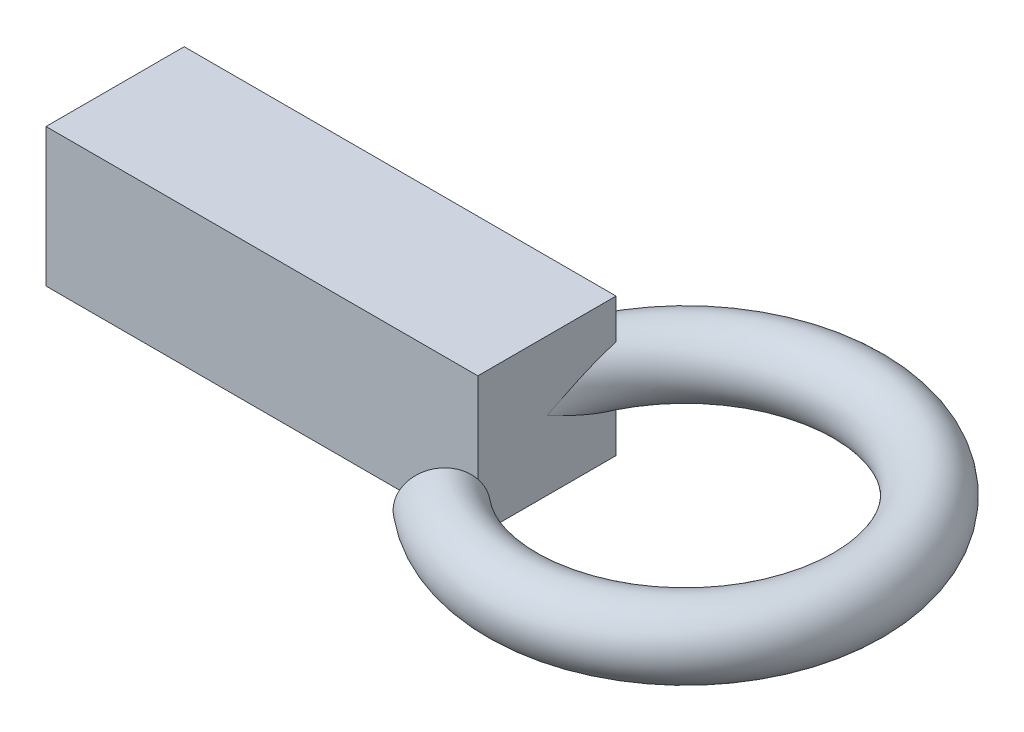
ISO-10303-21;
HEADER;
FILE_DESCRIPTION(('STEP AP214'),'2;1');
FILE_NAME('part.step','',(''),(''),'','','');
FILE_SCHEMA(('AUTOMOTIVE_DESIGN { 1 0 10303 214 1 1 1 1 }'));
ENDSEC;
DATA;
#1=APPLICATION_CONTEXT('core data for automotive mechanical design processes');
#2=APPLICATION_PROTOCOL_DEFINITION('international standard','automotive_design',2000,#1);
#3=PRODUCT_CONTEXT('',#1,'mechanical');
#4=PRODUCT('Part','Part','',(#3));
#5=PRODUCT_RELATED_PRODUCT_CATEGORY('part','',(#4));
#6=PRODUCT_DEFINITION_FORMATION('','',#4);
#7=PRODUCT_DEFINITION_CONTEXT('part definition',#1,'design');
#8=PRODUCT_DEFINITION('design','',#6,#7);
#9=PRODUCT_DEFINITION_SHAPE('','',#8);
#10=(LENGTH_UNIT() NAMED_UNIT(*) SI_UNIT(.MILLI.,.METRE.));
#11=(NAMED_UNIT(*) PLANE_ANGLE_UNIT() SI_UNIT($,.RADIAN.));
#12=(NAMED_UNIT(*) SI_UNIT($,.STERADIAN.) SOLID_ANGLE_UNIT());
#13=UNCERTAINTY_MEASURE_WITH_UNIT(LENGTH_MEASURE(1.E-05),#10,'distance_accuracy_value','');
#14=(GEOMETRIC_REPRESENTATION_CONTEXT(3) GLOBAL_UNCERTAINTY_ASSIGNED_CONTEXT((#13)) GLOBAL_UNIT_ASSIGNED_CONTEXT((#10,
#11,#12)) REPRESENTATION_CONTEXT('',''));
#15=CARTESIAN_POINT('',(0.,0.,0.));
#16=DIRECTION('',(0.,0.,1.));
#17=DIRECTION('',(1.,0.,0.));
#18=AXIS2_PLACEMENT_3D('',#15,#16,#17);
#19=CARTESIAN_POINT('',(-46.,8.,8.));
#20=DIRECTION('',(1.,0.,0.));
#21=DIRECTION('',(0.,0.,-1.));
#22=AXIS2_PLACEMENT_3D('',#19,#20,#21);
#23=PLANE('',#22);
#24=CARTESIAN_POINT('',(-46.,0.,0.));
#25=DIRECTION('',(-1.,0.,0.));
#26=DIRECTION('',(0.,0.,1.));
#27=AXIS2_PLACEMENT_3D('',#24,#25,#26);
#28=CIRCLE('',#27,3.4);
#29=CARTESIAN_POINT('',(-46.,0.,3.4));
#30=VERTEX_POINT('',#29);
#31=EDGE_CURVE('E106',#30,#30,#28,.T.);
#32=ORIENTED_EDGE('',*,*,#31,.F.);
#33=EDGE_LOOP('',(#32));
#34=FACE_BOUND('',#33,.T.);
#35=DIRECTION('',(0.,0.,1.));
#36=VECTOR('',#35,1.);
#37=CARTESIAN_POINT('',(-46.,-8.,8.));
#38=LINE('',#37,#36);
#39=CARTESIAN_POINT('',(-46.,-8.,-8.));
#40=VERTEX_POINT('',#39);
#41=CARTESIAN_POINT('',(-46.,-8.,8.));
#42=VERTEX_POINT('',#41);
#43=EDGE_CURVE('E105',#40,#42,#38,.T.);
#44=ORIENTED_EDGE('',*,*,#43,.T.);
#45=DIRECTION('',(0.,-1.,0.));
#46=VECTOR('',#45,1.);
#47=CARTESIAN_POINT('',(-46.,8.,8.));
#48=LINE('',#47,#46);
#49=CARTESIAN_POINT('',(-46.,8.,8.));
#50=VERTEX_POINT('',#49);
#51=EDGE_CURVE('E137',#50,#42,#48,.T.);
#52=ORIENTED_EDGE('',*,*,#51,.F.);
#53=DIRECTION('',(0.,0.,1.));
#54=VECTOR('',#53,1.);
#55=CARTESIAN_POINT('',(-46.,8.,8.));
#56=LINE('',#55,#54);
#57=CARTESIAN_POINT('',(-46.,8.,-8.));
#58=VERTEX_POINT('',#57);
#59=EDGE_CURVE('E114',#58,#50,#56,.T.);
#60=ORIENTED_EDGE('',*,*,#59,.F.);
#61=DIRECTION('',(0.,-1.,0.));
#62=VECTOR('',#61,1.);
#63=CARTESIAN_POINT('',(-46.,8.,-8.));
#64=LINE('',#63,#62);
#65=EDGE_CURVE('E123',#58,#40,#64,.T.);
#66=ORIENTED_EDGE('',*,*,#65,.T.);
#67=EDGE_LOOP('',(#44,#52,#60,#66));
#68=FACE_BOUND('',#67,.T.);
#69=ADVANCED_FACE('F40',(#34,#68),#23,.F.);
#70=CARTESIAN_POINT('',(4.,8.,8.));
#71=DIRECTION('',(0.,0.,-1.));
#72=DIRECTION('',(-1.,0.,0.));
#73=AXIS2_PLACEMENT_3D('',#70,#71,#72);
#74=PLANE('',#73);
#75=DIRECTION('',(1.,0.,0.));
#76=VECTOR('',#75,1.);
#77=CARTESIAN_POINT('',(4.,-8.,8.));
#78=LINE('',#77,#76);
#79=CARTESIAN_POINT('',(4.,-8.,8.));
#80=VERTEX_POINT('',#79);
#81=EDGE_CURVE('E109',#42,#80,#78,.T.);
#82=ORIENTED_EDGE('',*,*,#81,.T.);
#83=DIRECTION('',(0.,-1.,0.));
#84=VECTOR('',#83,1.);
#85=CARTESIAN_POINT('',(4.,8.,8.));
#86=LINE('',#85,#84);
#87=CARTESIAN_POINT('',(4.,8.,8.));
#88=VERTEX_POINT('',#87);
#89=EDGE_CURVE('E134',#88,#80,#86,.T.);
#90=ORIENTED_EDGE('',*,*,#89,.F.);
#91=DIRECTION('',(1.,0.,0.));
#92=VECTOR('',#91,1.);
#93=CARTESIAN_POINT('',(4.,8.,8.));
#94=LINE('',#93,#92);
#95=EDGE_CURVE('E117',#50,#88,#94,.T.);
#96=ORIENTED_EDGE('',*,*,#95,.F.);
#97=ORIENTED_EDGE('',*,*,#51,.T.);
#98=EDGE_LOOP('',(#82,#90,#96,#97));
#99=FACE_BOUND('',#98,.T.);
#100=ADVANCED_FACE('F167',(#99),#74,.F.);
#101=CARTESIAN_POINT('',(4.,8.,8.));
#102=DIRECTION('',(-1.,0.,0.));
#103=DIRECTION('',(0.,0.,1.));
#104=AXIS2_PLACEMENT_3D('',#101,#102,#103);
#105=PLANE('',#104);
#106=CARTESIAN_POINT('',(4.,0.,0.));
#107=CARTESIAN_POINT('',(4.,-0.00377123438427667,-0.00754247117398003));
#108=CARTESIAN_POINT('',(4.,-0.00754247058504559,-0.0150849435227683));
#109=CARTESIAN_POINT('',(4.00000000000005,-0.310476094820006,-0.620954275123391));
#110=CARTESIAN_POINT('',(4.00000000000001,-0.609578074142393,-1.21932381549683));
#111=CARTESIAN_POINT('',(3.99999999999999,-1.19622811549225,-2.42167869156613));
#112=CARTESIAN_POINT('',(4.,-1.48377750561781,-3.02566337185225));
#113=CARTESIAN_POINT('',(4.,-2.03478647915034,-4.24378350719688));
#114=CARTESIAN_POINT('',(4.,-2.29827917478982,-4.85790359273509));
#115=CARTESIAN_POINT('',(4.,-2.66503026414286,-5.79014690740583));
#116=CARTESIAN_POINT('',(4.,-2.78250744166196,-6.10266093858747));
#117=CARTESIAN_POINT('',(4.,-3.00592255187489,-6.73176660254089));
#118=CARTESIAN_POINT('',(4.,-3.11186222479747,-7.04835761229462));
#119=CARTESIAN_POINT('',(4.,-3.30251955374235,-7.66197536977994));
#120=CARTESIAN_POINT('',(4.,-3.38823247278577,-7.95869110738419));
#121=CARTESIAN_POINT('',(4.,-3.54581053916475,-8.55583579984154));
#122=CARTESIAN_POINT('',(4.,-3.61767464912955,-8.85626503106846));
#123=CARTESIAN_POINT('',(4.,-3.7453680928628,-9.4612138022541));
#124=CARTESIAN_POINT('',(4.,-3.80116325404704,-9.76574063855015));
#125=CARTESIAN_POINT('',(4.,-3.89385026027332,-10.3776780263353));
#126=CARTESIAN_POINT('',(4.,-3.93074497404804,-10.6850881329812));
#127=CARTESIAN_POINT('',(4.,-3.97888981327671,-11.2579288120443));
#128=CARTESIAN_POINT('',(4.,-3.99304100139695,-11.5231114505689));
#129=CARTESIAN_POINT('',(4.,-4.00297820361671,-12.0539166762168));
#130=CARTESIAN_POINT('',(4.,-3.99876187151914,-12.3195393152121));
#131=CARTESIAN_POINT('',(4.,-3.96955046211187,-12.8481564017722));
#132=CARTESIAN_POINT('',(4.,-3.94467541900814,-13.1111571706437));
#133=CARTESIAN_POINT('',(4.,-3.87154696614128,-13.6339037500635));
#134=CARTESIAN_POINT('',(4.,-3.82330551915244,-13.8936511564878));
#135=CARTESIAN_POINT('',(4.,-3.72600997105123,-14.3000350495018));
#136=CARTESIAN_POINT('',(4.,-3.68564244520513,-14.4487747327245));
#137=CARTESIAN_POINT('',(4.,-3.59528759397715,-14.7432442649358));
#138=CARTESIAN_POINT('',(4.,-3.54530538348311,-14.8889756688476));
#139=CARTESIAN_POINT('',(4.,-3.43460113581124,-15.1777385092482));
#140=CARTESIAN_POINT('',(4.,-3.37379265612387,-15.3207371106529));
#141=CARTESIAN_POINT('',(4.,-3.24099762070377,-15.6016835250285));
#142=CARTESIAN_POINT('',(4.,-3.16899498499202,-15.7396237138912));
#143=CARTESIAN_POINT('',(4.,-3.09111855280429,-15.8742840697425));
#144=B_SPLINE_CURVE_WITH_KNOTS('',3,(#106,#107,#108,#109,#110,#111,#112,#113,#114,#115,#116,
#117,#118,#119,#120,#121,#122,#123,#124,#125,#126,#127,#128,#129,#130,#131,#132,#133,#134,#135,
#136,#137,#138,#139,#140,#141,#142,#143),.UNSPECIFIED.,.F.,.F.,(4,2,2,2,2,2,2,2,2,2,2,2,2,2,2,2,
2,2,4),(0.,0.0252982212813502,2.03214568439839,4.03876177412949,6.04257290148961,
7.04398987419776,8.04525559103838,8.97151591888568,9.89784560303596,10.8261309348252,
11.7542753285717,12.5504103705687,13.3466471108064,14.1382895470012,14.9295271179056,
15.3916090999346,15.8534459367827,16.3191507618209,16.7855308427105),.UNSPECIFIED.);
#145=CARTESIAN_POINT('',(4.,0.,0.));
#146=VERTEX_POINT('',#145);
#147=CARTESIAN_POINT('',(4.,-3.39731552846254,-8.));
#148=VERTEX_POINT('',#147);
#149=EDGE_CURVE('E11',#146,#148,#144,.T.);
#150=ORIENTED_EDGE('',*,*,#149,.F.);
#151=CARTESIAN_POINT('',(4.,0.,0.));
#152=CARTESIAN_POINT('',(4.,0.00377123438427667,-0.00754247117398003));
#153=CARTESIAN_POINT('',(4.,0.00754247058504559,-0.0150849435227683));
#154=CARTESIAN_POINT('',(4.00000000000005,0.310476094820006,-0.620954275123391));
#155=CARTESIAN_POINT('',(4.00000000000001,0.609578074142393,-1.21932381549683));
#156=CARTESIAN_POINT('',(3.99999999999999,1.19622811549225,-2.42167869156613));
#157=CARTESIAN_POINT('',(4.,1.48377750561781,-3.02566337185225));
#158=CARTESIAN_POINT('',(4.,2.03478647915034,-4.24378350719688));
#159=CARTESIAN_POINT('',(4.,2.29827917478982,-4.85790359273509));
#160=CARTESIAN_POINT('',(4.,2.66503026414286,-5.79014690740583));
#161=CARTESIAN_POINT('',(4.,2.78250744166196,-6.10266093858747));
#162=CARTESIAN_POINT('',(4.,3.00592255187489,-6.73176660254089));
#163=CARTESIAN_POINT('',(4.,3.11186222479747,-7.04835761229462));
#164=CARTESIAN_POINT('',(4.,3.30251955374235,-7.66197536977994));
#165=CARTESIAN_POINT('',(4.,3.38823247278577,-7.95869110738419));
#166=CARTESIAN_POINT('',(4.,3.54581053916475,-8.55583579984154));
#167=CARTESIAN_POINT('',(4.,3.61767464912955,-8.85626503106846));
#168=CARTESIAN_POINT('',(4.,3.7453680928628,-9.4612138022541));
#169=CARTESIAN_POINT('',(4.,3.80116325404704,-9.76574063855015));
#170=CARTESIAN_POINT('',(4.,3.89385026027332,-10.3776780263353));
#171=CARTESIAN_POINT('',(4.,3.93074497404804,-10.6850881329812));
#172=CARTESIAN_POINT('',(4.,3.97888981327671,-11.2579288120443));
#173=CARTESIAN_POINT('',(4.,3.99304100139695,-11.5231114505689));
#174=CARTESIAN_POINT('',(4.,4.00297820361671,-12.0539166762168));
#175=CARTESIAN_POINT('',(4.,3.99876187151914,-12.3195393152121));
#176=CARTESIAN_POINT('',(4.,3.96955046211187,-12.8481564017722));
#177=CARTESIAN_POINT('',(4.,3.94467541900814,-13.1111571706437));
#178=CARTESIAN_POINT('',(4.,3.87154696614128,-13.6339037500635));
#179=CARTESIAN_POINT('',(4.,3.82330551915244,-13.8936511564878));
#180=CARTESIAN_POINT('',(4.,3.72600997105123,-14.3000350495018));
#181=CARTESIAN_POINT('',(4.,3.68564244520513,-14.4487747327245));
#182=CARTESIAN_POINT('',(4.,3.59528759397715,-14.7432442649358));
#183=CARTESIAN_POINT('',(4.,3.54530538348311,-14.8889756688476));
#184=CARTESIAN_POINT('',(4.,3.43460113581124,-15.1777385092482));
#185=CARTESIAN_POINT('',(4.,3.37379265612387,-15.3207371106529));
#186=CARTESIAN_POINT('',(4.,3.24099762070377,-15.6016835250285));
#187=CARTESIAN_POINT('',(4.,3.16899498499202,-15.7396237138912));
#188=CARTESIAN_POINT('',(4.,3.09111855280429,-15.8742840697425));
#189=B_SPLINE_CURVE_WITH_KNOTS('',3,(#151,#152,#153,#154,#155,#156,#157,#158,#159,#160,#161,
#162,#163,#164,#165,#166,#167,#168,#169,#170,#171,#172,#173,#174,#175,#176,#177,#178,#179,#180,
#181,#182,#183,#184,#185,#186,#187,#188),.UNSPECIFIED.,.F.,.F.,(4,2,2,2,2,2,2,2,2,2,2,2,2,2,2,2,
2,2,4),(0.,0.0252982212813502,2.03214568439839,4.03876177412949,6.04257290148961,
7.04398987419776,8.04525559103838,8.97151591888568,9.89784560303596,10.8261309348252,
11.7542753285717,12.5504103705687,13.3466471108064,14.1382895470012,14.9295271179056,
15.3916090999346,15.8534459367827,16.3191507618209,16.7855308427105),.UNSPECIFIED.);
#190=CARTESIAN_POINT('',(4.00000000000118,3.39731552846188,-8.));
#191=VERTEX_POINT('',#190);
#192=EDGE_CURVE('E53',#191,#146,#189,.F.);
#193=ORIENTED_EDGE('',*,*,#192,.F.);
#194=DIRECTION('',(0.,-1.,0.));
#195=VECTOR('',#194,1.);
#196=CARTESIAN_POINT('',(4.,8.,-8.));
#197=LINE('',#196,#195);
#198=CARTESIAN_POINT('',(4.,8.,-8.));
#199=VERTEX_POINT('',#198);
#200=EDGE_CURVE('E60',#199,#191,#197,.T.);
#201=ORIENTED_EDGE('',*,*,#200,.F.);
#202=DIRECTION('',(0.,0.,-1.));
#203=VECTOR('',#202,1.);
#204=CARTESIAN_POINT('',(4.,8.,8.));
#205=LINE('',#204,#203);
#206=EDGE_CURVE('E120',#88,#199,#205,.T.);
#207=ORIENTED_EDGE('',*,*,#206,.F.);
#208=ORIENTED_EDGE('',*,*,#89,.T.);
#209=DIRECTION('',(0.,0.,-1.));
#210=VECTOR('',#209,1.);
#211=CARTESIAN_POINT('',(4.,-8.,8.));
#212=LINE('',#211,#210);
#213=CARTESIAN_POINT('',(4.,-8.,-8.));
#214=VERTEX_POINT('',#213);
#215=EDGE_CURVE('E126',#80,#214,#212,.T.);
#216=ORIENTED_EDGE('',*,*,#215,.T.);
#217=EDGE_CURVE('E132',#148,#214,#197,.T.);
#218=ORIENTED_EDGE('',*,*,#217,.F.);
#219=EDGE_LOOP('',(#150,#193,#201,#207,#208,#216,#218));
#220=FACE_BOUND('',#219,.T.);
#221=ADVANCED_FACE('F161',(#220),#105,.F.);
#222=CARTESIAN_POINT('',(4.,8.,-8.));
#223=DIRECTION('',(0.,0.,1.));
#224=DIRECTION('',(1.,0.,0.));
#225=AXIS2_PLACEMENT_3D('',#222,#223,#224);
#226=PLANE('',#225);
#227=CARTESIAN_POINT('',(-1.91813324047437,-2.21237098211823,-8.));
#228=CARTESIAN_POINT('',(-2.04281968004621,-2.03592268123638,-8.));
#229=CARTESIAN_POINT('',(-2.15313345145666,-1.84915600177252,-8.));
#230=CARTESIAN_POINT('',(-2.34115725178285,-1.45972556908713,-8.));
#231=CARTESIAN_POINT('',(-2.41884400629237,-1.25705058962564,-8.));
#232=CARTESIAN_POINT('',(-2.53880882046758,-0.841251179909869,-8.));
#233=CARTESIAN_POINT('',(-2.58105689686851,-0.628118062466796,-8.));
#234=CARTESIAN_POINT('',(-2.62843378159131,-0.197797165469814,-8.));
#235=CARTESIAN_POINT('',(-2.63357003722268,0.0193897918204563,-8.));
#236=CARTESIAN_POINT('',(-2.60679128013833,0.447668366354804,-8.));
#237=CARTESIAN_POINT('',(-2.5755167134589,0.658800392588246,-8.));
#238=CARTESIAN_POINT('',(-2.47810294856619,1.0728414802993,-8.));
#239=CARTESIAN_POINT('',(-2.41196381464751,1.27575055694032,-8.));
#240=CARTESIAN_POINT('',(-2.24677889514995,1.66873076205972,-8.));
#241=CARTESIAN_POINT('',(-2.14758789517828,1.8587407030001,-8.));
#242=CARTESIAN_POINT('',(-1.91972032250424,2.22013597297991,-8.));
#243=CARTESIAN_POINT('',(-1.79104028761106,2.39151911163433,-8.));
#244=CARTESIAN_POINT('',(-1.50337393162601,2.7172692043475,-8.));
#245=CARTESIAN_POINT('',(-1.343499266483,2.87085056563841,-8.));
#246=CARTESIAN_POINT('',(-1.00146008749896,3.15072522179999,-8.));
#247=CARTESIAN_POINT('',(-0.819290562518248,3.27701236413401,-8.));
#248=CARTESIAN_POINT('',(-0.426820174936007,3.50652693757035,-8.));
#249=CARTESIAN_POINT('',(-0.215505722674584,3.60801955022575,-8.));
#250=CARTESIAN_POINT('',(0.220387742930391,3.77665309444852,-8.));
#251=CARTESIAN_POINT('',(0.444970702377723,3.84378374869252,-8.));
#252=CARTESIAN_POINT('',(0.917386763105667,3.94658065741515,-8.));
#253=CARTESIAN_POINT('',(1.16575819906745,3.97977390392674,-8.));
#254=CARTESIAN_POINT('',(1.66462757045102,4.00658236226624,-8.));
#255=CARTESIAN_POINT('',(1.9151261644815,4.00018483401566,-8.));
#256=CARTESIAN_POINT('',(2.42723016784171,3.94707810812314,-8.));
#257=CARTESIAN_POINT('',(2.68858613078005,3.89794419115391,-8.));
#258=CARTESIAN_POINT('',(3.19981107797521,3.75754091976531,-8.));
#259=CARTESIAN_POINT('',(3.4496765217868,3.66625867304156,-8.));
#260=CARTESIAN_POINT('',(3.93624589043756,3.44090990897901,-8.));
#261=CARTESIAN_POINT('',(4.17252462354354,3.30592290055846,-8.));
#262=CARTESIAN_POINT('',(4.61774460856435,2.99606984561744,-8.));
#263=CARTESIAN_POINT('',(4.82668693303807,2.8212053644502,-8.));
#264=CARTESIAN_POINT('',(5.1076899735121,2.53688743213978,-8.));
#265=CARTESIAN_POINT('',(5.19404830683801,2.44125510284688,-8.));
#266=CARTESIAN_POINT('',(5.35748117077875,2.24238570482727,-8.));
#267=CARTESIAN_POINT('',(5.43456076364347,2.13915283277007,-8.));
#268=CARTESIAN_POINT('',(5.57833736626069,1.92578662093331,-8.));
#269=CARTESIAN_POINT('',(5.64504107146971,1.81565779594227,-8.));
#270=CARTESIAN_POINT('',(5.76706505186402,1.58926014935577,-8.));
#271=CARTESIAN_POINT('',(5.82238725047104,1.47299236939549,-8.));
#272=CARTESIAN_POINT('',(5.91459467273483,1.24998234888362,-8.));
#273=CARTESIAN_POINT('',(5.95291145370518,1.14383056888798,-8.));
#274=CARTESIAN_POINT('',(6.01943305261974,0.928408737445381,-8.));
#275=CARTESIAN_POINT('',(6.04763942059266,0.819139166762817,-8.));
#276=CARTESIAN_POINT('',(6.09345338896193,0.598479126985245,-8.));
#277=CARTESIAN_POINT('',(6.11106865129757,0.487090251391562,-8.));
#278=CARTESIAN_POINT('',(6.13541728051916,0.263131160570105,-8.));
#279=CARTESIAN_POINT('',(6.14215161773798,0.150561051582902,-8.));
#280=CARTESIAN_POINT('',(6.14447987945759,-0.0619017252188389,-8.));
#281=CARTESIAN_POINT('',(6.14125136943802,-0.161783284306514,-8.));
#282=CARTESIAN_POINT('',(6.12619789469959,-0.360928187309228,-8.));
#283=CARTESIAN_POINT('',(6.11437027431273,-0.460191330684955,-8.));
#284=CARTESIAN_POINT('',(6.08228596516549,-0.657301937164534,-8.));
#285=CARTESIAN_POINT('',(6.0620330594184,-0.755150015264947,-8.));
#286=CARTESIAN_POINT('',(6.01338202772603,-0.948811936887422,-8.));
#287=CARTESIAN_POINT('',(5.98498079485459,-1.04462498946663,-8.));
#288=CARTESIAN_POINT('',(5.88883942329831,-1.32577771292127,-8.));
#289=CARTESIAN_POINT('',(5.80973756832937,-1.50735513223044,-8.));
#290=CARTESIAN_POINT('',(5.6245902057424,-1.85603030114782,-8.));
#291=CARTESIAN_POINT('',(5.51853736883197,-2.02312409534509,-8.));
#292=CARTESIAN_POINT('',(5.27304410118173,-2.3539616301661,-8.));
#293=CARTESIAN_POINT('',(5.13149852289399,-2.51614234650429,-8.));
#294=CARTESIAN_POINT('',(4.82592002831266,-2.81766690634238,-8.));
#295=CARTESIAN_POINT('',(4.66187646722744,-2.95699987062915,-8.));
#296=CARTESIAN_POINT('',(4.2944130039611,-3.22673807958741,-8.));
#297=CARTESIAN_POINT('',(4.08863179554282,-3.35392999736972,-8.));
#298=CARTESIAN_POINT('',(3.66006594167276,-3.57544753224182,-8.));
#299=CARTESIAN_POINT('',(3.43727348485129,-3.66975793853195,-8.));
#300=CARTESIAN_POINT('',(2.95855371416888,-3.83127205977884,-8.));
#301=CARTESIAN_POINT('',(2.70148111543473,-3.89509034093744,-8.));
#302=CARTESIAN_POINT('',(2.18018546510734,-3.97992644525405,-8.));
#303=CARTESIAN_POINT('',(1.9159609741489,-4.00093558691079,-8.));
#304=CARTESIAN_POINT('',(1.51648615745908,-3.99946991048486,-8.));
#305=CARTESIAN_POINT('',(1.38100352166168,-3.99317329641622,-8.));
#306=CARTESIAN_POINT('',(1.11110287072351,-3.96891041888265,-8.));
#307=CARTESIAN_POINT('',(0.976684453405941,-3.9509487999444,-8.));
#308=CARTESIAN_POINT('',(0.709858453881394,-3.90329923214092,-8.));
#309=CARTESIAN_POINT('',(0.577452192975051,-3.87360389678402,-8.));
#310=CARTESIAN_POINT('',(0.315868094881807,-3.8025355676135,-8.));
#311=CARTESIAN_POINT('',(0.186688759867366,-3.76116810550846,-8.));
#312=CARTESIAN_POINT('',(-0.0627264839606308,-3.66859637734439,-8.));
#313=CARTESIAN_POINT('',(-0.183116667086022,-3.61780784249604,-8.));
#314=CARTESIAN_POINT('',(-0.418838272228203,-3.50571881729788,-8.));
#315=CARTESIAN_POINT('',(-0.534172061065029,-3.44442331251774,-8.));
#316=CARTESIAN_POINT('',(-0.758649962332366,-3.31168313863194,-8.));
#317=CARTESIAN_POINT('',(-0.867802016172371,-3.24025192416375,-8.));
#318=CARTESIAN_POINT('',(-1.07898538955151,-3.08762555641023,-8.));
#319=CARTESIAN_POINT('',(-1.18101927981496,-3.00643395723828,-8.));
#320=CARTESIAN_POINT('',(-1.39888036890484,-2.81558852099575,-8.));
#321=CARTESIAN_POINT('',(-1.51270323896189,-2.70362669736207,-8.));
#322=CARTESIAN_POINT('',(-1.72633530797948,-2.4671049206481,-8.));
#323=CARTESIAN_POINT('',(-1.82614563256988,-2.34254598088049,-8.));
#324=CARTESIAN_POINT('',(-1.91813324047437,-2.21237098211823,-8.));
#325=B_SPLINE_CURVE_WITH_KNOTS('',3,(#227,#228,#229,#230,#231,#232,#233,#234,#235,#236,#237,
#238,#239,#240,#241,#242,#243,#244,#245,#246,#247,#248,#249,#250,#251,#252,#253,#254,#255,#256,
#257,#258,#259,#260,#261,#262,#263,#264,#265,#266,#267,#268,#269,#270,#271,#272,#273,#274,#275,
#276,#277,#278,#279,#280,#281,#282,#283,#284,#285,#286,#287,#288,#289,#290,#291,#292,#293,#294,
#295,#296,#297,#298,#299,#300,#301,#302,#303,#304,#305,#306,#307,#308,#309,#310,#311,#312,#313,
#314,#315,#316,#317,#318,#319,#320,#321,#322,#323,#324),.UNSPECIFIED.,.T.,.F.,(4,2,2,2,2,2,2,2,
2,2,2,2,2,2,2,2,2,2,2,2,2,2,2,2,2,2,2,2,2,2,2,2,2,2,2,2,2,2,2,2,2,2,2,2,2,2,2,2,4),(0.,
0.647638573953495,1.29573835787641,1.94438592192466,2.59290331684464,3.23018383781938,
3.86746318357366,4.50758018753658,5.1477723836392,5.80993000423732,6.47223673002918,
7.17247350669498,7.87291959508927,8.62139279432573,9.37010686035738,10.1642938651001,
10.9587239563516,11.77111206988,12.5834682993533,12.9695789227553,13.355477929814,
13.741126877743,14.1267105991595,14.4648051945932,14.8028479345099,15.1406458284917,
15.4784135968643,15.7778488683385,16.0773766538753,16.3767700942095,16.6762778441881,
17.2677084229401,17.8593000130825,18.5024846737232,19.1459747101793,19.8687219313151,
20.5918030489668,21.3829195454789,22.1741964609036,22.5806631305778,22.9869680610263,
23.3935291730151,23.7998979283738,24.1913844279707,24.5826856783856,24.9734722730543,
25.3641169966152,25.8419517329519,26.3197480627632),.UNSPECIFIED.);
#326=EDGE_CURVE('E143',#148,#191,#325,.T.);
#327=ORIENTED_EDGE('',*,*,#326,.F.);
#328=ORIENTED_EDGE('',*,*,#217,.T.);
#329=DIRECTION('',(-1.,0.,0.));
#330=VECTOR('',#329,1.);
#331=CARTESIAN_POINT('',(4.,-8.,-8.));
#332=LINE('',#331,#330);
#333=EDGE_CURVE('E118',#214,#40,#332,.T.);
#334=ORIENTED_EDGE('',*,*,#333,.T.);
#335=ORIENTED_EDGE('',*,*,#65,.F.);
#336=DIRECTION('',(-1.,0.,0.));
#337=VECTOR('',#336,1.);
#338=CARTESIAN_POINT('',(4.,8.,-8.));
#339=LINE('',#338,#337);
#340=EDGE_CURVE('E122',#199,#58,#339,.T.);
#341=ORIENTED_EDGE('',*,*,#340,.F.);
#342=ORIENTED_EDGE('',*,*,#200,.T.);
#343=EDGE_LOOP('',(#327,#328,#334,#335,#341,#342));
#344=FACE_BOUND('',#343,.T.);
#345=ADVANCED_FACE('F156',(#344),#226,.F.);
#346=CARTESIAN_POINT('',(0.,8.,0.));
#347=DIRECTION('',(0.,1.,0.));
#348=DIRECTION('',(0.,0.,1.));
#349=AXIS2_PLACEMENT_3D('',#346,#347,#348);
#350=PLANE('',#349);
#351=ORIENTED_EDGE('',*,*,#59,.T.);
#352=ORIENTED_EDGE('',*,*,#95,.T.);
#353=ORIENTED_EDGE('',*,*,#206,.T.);
#354=ORIENTED_EDGE('',*,*,#340,.T.);
#355=EDGE_LOOP('',(#351,#352,#353,#354));
#356=FACE_BOUND('',#355,.T.);
#357=ADVANCED_FACE('F160',(#356),#350,.T.);
#358=CARTESIAN_POINT('',(0.,-8.,0.));
#359=DIRECTION('',(0.,1.,0.));
#360=DIRECTION('',(0.,0.,1.));
#361=AXIS2_PLACEMENT_3D('',#358,#359,#360);
#362=PLANE('',#361);
#363=ORIENTED_EDGE('',*,*,#43,.F.);
#364=ORIENTED_EDGE('',*,*,#333,.F.);
#365=ORIENTED_EDGE('',*,*,#215,.F.);
#366=ORIENTED_EDGE('',*,*,#81,.F.);
#367=EDGE_LOOP('',(#363,#364,#365,#366));
#368=FACE_BOUND('',#367,.T.);
#369=ADVANCED_FACE('F162',(#368),#362,.F.);
#370=CARTESIAN_POINT('',(20.,0.,0.));
#371=DIRECTION('',(0.,1.,0.));
#372=DIRECTION('',(0.,0.,1.));
#373=AXIS2_PLACEMENT_3D('',#370,#371,#372);
#374=TOROIDAL_SURFACE('',#373,20.,4.);
#375=CARTESIAN_POINT('',(7.14424780626913,0.,15.3208888623795));
#376=DIRECTION('',(0.766044443118975,0.,0.642787609686544));
#377=DIRECTION('',(0.642787609686544,0.,-0.766044443118975));
#378=AXIS2_PLACEMENT_3D('',#375,#376,#377);
#379=CIRCLE('',#378,4.);
#380=CARTESIAN_POINT('',(9.7153982450153,0.,12.2567110899036));
#381=VERTEX_POINT('',#380);
#382=EDGE_CURVE('E140',#381,#381,#379,.T.);
#383=ORIENTED_EDGE('',*,*,#382,.T.);
#384=EDGE_LOOP('',(#383));
#385=FACE_BOUND('',#384,.T.);
#386=ORIENTED_EDGE('',*,*,#192,.T.);
#387=ORIENTED_EDGE('',*,*,#149,.T.);
#388=ORIENTED_EDGE('',*,*,#326,.T.);
#389=EDGE_LOOP('',(#386,#387,#388));
#390=FACE_BOUND('',#389,.T.);
#391=ADVANCED_FACE('F153',(#385,#390),#374,.T.);
#392=CARTESIAN_POINT('',(7.14424780626913,0.,15.3208888623795));
#393=DIRECTION('',(0.766044443118975,0.,0.642787609686544));
#394=DIRECTION('',(0.642787609686544,0.,-0.766044443118975));
#395=AXIS2_PLACEMENT_3D('',#392,#393,#394);
#396=PLANE('',#395);
#397=ORIENTED_EDGE('',*,*,#382,.F.);
#398=EDGE_LOOP('',(#397));
#399=FACE_BOUND('',#398,.T.);
#400=ADVANCED_FACE('F42',(#399),#396,.F.);
#401=CARTESIAN_POINT('',(-16.,0.,0.));
#402=DIRECTION('',(-1.,0.,0.));
#403=DIRECTION('',(0.,0.,1.));
#404=AXIS2_PLACEMENT_3D('',#401,#402,#403);
#405=CONICAL_SURFACE('',#404,3.39999999999999,1.02974425867665);
#406=CARTESIAN_POINT('',(-13.9570738953063,0.,0.));
#407=VERTEX_POINT('',#406);
#408=VERTEX_LOOP('',#407);
#409=FACE_BOUND('',#408,.T.);
#410=CARTESIAN_POINT('',(-16.,0.,0.));
#411=DIRECTION('',(-1.,0.,0.));
#412=DIRECTION('',(0.,0.,1.));
#413=AXIS2_PLACEMENT_3D('',#410,#411,#412);
#414=CIRCLE('',#413,3.39999999999999);
#415=CARTESIAN_POINT('',(-16.,0.,3.39999999999999));
#416=VERTEX_POINT('',#415);
#417=EDGE_CURVE('E103',#416,#416,#414,.T.);
#418=ORIENTED_EDGE('',*,*,#417,.T.);
#419=EDGE_LOOP('',(#418));
#420=FACE_BOUND('',#419,.T.);
#421=ADVANCED_FACE('F96',(#409,#420),#405,.F.);
#422=CARTESIAN_POINT('',(-46.,0.,0.));
#423=DIRECTION('',(-1.,0.,0.));
#424=DIRECTION('',(0.,0.,1.));
#425=AXIS2_PLACEMENT_3D('',#422,#423,#424);
#426=CYLINDRICAL_SURFACE('',#425,3.39999999999999);
#427=ORIENTED_EDGE('',*,*,#417,.F.);
#428=EDGE_LOOP('',(#427));
#429=FACE_BOUND('',#428,.T.);
#430=ORIENTED_EDGE('',*,*,#31,.T.);
#431=EDGE_LOOP('',(#430));
#432=FACE_BOUND('',#431,.T.);
#433=ADVANCED_FACE('F99',(#429,#432),#426,.F.);
#434=CLOSED_SHELL('',(#69,#100,#221,#345,#357,#369,#391,#400,#421,#433));
#435=MANIFOLD_SOLID_BREP('B2',#434);
#436=ADVANCED_BREP_SHAPE_REPRESENTATION('',(#18,#435),#14);
#437=SHAPE_DEFINITION_REPRESENTATION(#9,#436);
ENDSEC;
END-ISO-10303-21;
